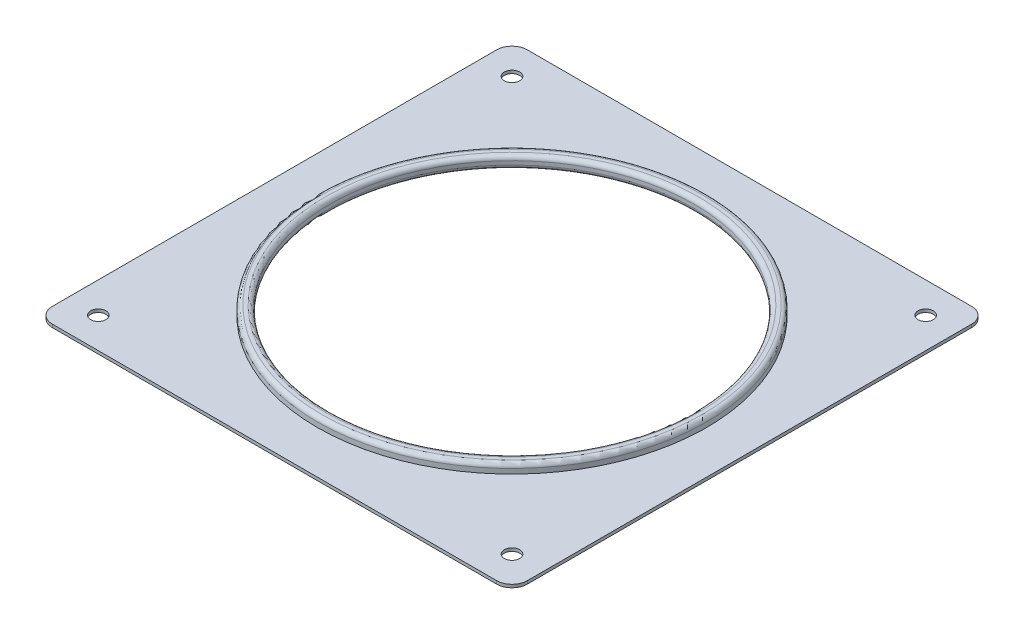
ISO-10303-21;
HEADER;
FILE_DESCRIPTION(('STEP AP214'),'2;1');
FILE_NAME('part.step','',(''),(''),'','','');
FILE_SCHEMA(('AUTOMOTIVE_DESIGN { 1 0 10303 214 1 1 1 1 }'));
ENDSEC;
DATA;
#1=APPLICATION_CONTEXT('core data for automotive mechanical design processes');
#2=APPLICATION_PROTOCOL_DEFINITION('international standard','automotive_design',2000,#1);
#3=PRODUCT_CONTEXT('',#1,'mechanical');
#4=PRODUCT('Part','Part','',(#3));
#5=PRODUCT_RELATED_PRODUCT_CATEGORY('part','',(#4));
#6=PRODUCT_DEFINITION_FORMATION('','',#4);
#7=PRODUCT_DEFINITION_CONTEXT('part definition',#1,'design');
#8=PRODUCT_DEFINITION('design','',#6,#7);
#9=PRODUCT_DEFINITION_SHAPE('','',#8);
#10=(LENGTH_UNIT() NAMED_UNIT(*) SI_UNIT(.MILLI.,.METRE.));
#11=(NAMED_UNIT(*) PLANE_ANGLE_UNIT() SI_UNIT($,.RADIAN.));
#12=(NAMED_UNIT(*) SI_UNIT($,.STERADIAN.) SOLID_ANGLE_UNIT());
#13=UNCERTAINTY_MEASURE_WITH_UNIT(LENGTH_MEASURE(1.E-05),#10,'distance_accuracy_value','');
#14=(GEOMETRIC_REPRESENTATION_CONTEXT(3) GLOBAL_UNCERTAINTY_ASSIGNED_CONTEXT((#13)) GLOBAL_UNIT_ASSIGNED_CONTEXT((#10,
#11,#12)) REPRESENTATION_CONTEXT('',''));
#15=CARTESIAN_POINT('',(0.,0.,0.));
#16=DIRECTION('',(0.,0.,1.));
#17=DIRECTION('',(1.,0.,0.));
#18=AXIS2_PLACEMENT_3D('',#15,#16,#17);
#19=CARTESIAN_POINT('',(-72.5,1.,72.5));
#20=DIRECTION('',(0.,1.,0.));
#21=DIRECTION('',(0.,0.,1.));
#22=AXIS2_PLACEMENT_3D('',#19,#20,#21);
#23=PLANE('',#22);
#24=CARTESIAN_POINT('',(-67.4999999999966,1.,67.5));
#25=DIRECTION('',(0.,1.,0.));
#26=DIRECTION('',(0.,0.,1.));
#27=AXIS2_PLACEMENT_3D('',#24,#25,#26);
#28=CIRCLE('',#27,2.5);
#29=CARTESIAN_POINT('',(-67.4999999999966,1.,70.));
#30=VERTEX_POINT('',#29);
#31=EDGE_CURVE('E387',#30,#30,#28,.T.);
#32=ORIENTED_EDGE('',*,*,#31,.F.);
#33=EDGE_LOOP('',(#32));
#34=FACE_BOUND('',#33,.T.);
#35=CARTESIAN_POINT('',(67.5,1.,-67.5000000000034));
#36=DIRECTION('',(0.,1.,0.));
#37=DIRECTION('',(0.,0.,1.));
#38=AXIS2_PLACEMENT_3D('',#35,#36,#37);
#39=CIRCLE('',#38,2.5);
#40=CARTESIAN_POINT('',(67.5,1.,-65.0000000000034));
#41=VERTEX_POINT('',#40);
#42=EDGE_CURVE('E405',#41,#41,#39,.T.);
#43=ORIENTED_EDGE('',*,*,#42,.F.);
#44=EDGE_LOOP('',(#43));
#45=FACE_BOUND('',#44,.T.);
#46=CARTESIAN_POINT('',(-72.5,1.,72.5));
#47=DIRECTION('',(0.,1.,0.));
#48=DIRECTION('',(0.,0.,1.));
#49=AXIS2_PLACEMENT_3D('',#46,#47,#48);
#50=CIRCLE('',#49,5.);
#51=CARTESIAN_POINT('',(-77.5,1.,72.5));
#52=VERTEX_POINT('',#51);
#53=CARTESIAN_POINT('',(-72.5,1.,77.5));
#54=VERTEX_POINT('',#53);
#55=EDGE_CURVE('E150',#52,#54,#50,.T.);
#56=ORIENTED_EDGE('',*,*,#55,.T.);
#57=DIRECTION('',(1.,0.,0.));
#58=VECTOR('',#57,1.);
#59=CARTESIAN_POINT('',(-72.5,1.,77.5));
#60=LINE('',#59,#58);
#61=CARTESIAN_POINT('',(72.5,1.,77.5));
#62=VERTEX_POINT('',#61);
#63=EDGE_CURVE('E98',#54,#62,#60,.T.);
#64=ORIENTED_EDGE('',*,*,#63,.T.);
#65=CARTESIAN_POINT('',(72.5,1.,72.5));
#66=DIRECTION('',(0.,1.,0.));
#67=DIRECTION('',(0.,0.,1.));
#68=AXIS2_PLACEMENT_3D('',#65,#66,#67);
#69=CIRCLE('',#68,5.);
#70=CARTESIAN_POINT('',(77.5,1.,72.5));
#71=VERTEX_POINT('',#70);
#72=EDGE_CURVE('E416',#62,#71,#69,.T.);
#73=ORIENTED_EDGE('',*,*,#72,.T.);
#74=DIRECTION('',(0.,0.,-1.));
#75=VECTOR('',#74,1.);
#76=CARTESIAN_POINT('',(77.5,1.,72.5));
#77=LINE('',#76,#75);
#78=CARTESIAN_POINT('',(77.5,1.,-72.5));
#79=VERTEX_POINT('',#78);
#80=EDGE_CURVE('E418',#71,#79,#77,.T.);
#81=ORIENTED_EDGE('',*,*,#80,.T.);
#82=CARTESIAN_POINT('',(72.5,1.,-72.5));
#83=DIRECTION('',(0.,1.,0.));
#84=DIRECTION('',(0.,0.,1.));
#85=AXIS2_PLACEMENT_3D('',#82,#83,#84);
#86=CIRCLE('',#85,5.);
#87=CARTESIAN_POINT('',(72.5,1.,-77.5));
#88=VERTEX_POINT('',#87);
#89=EDGE_CURVE('E117',#79,#88,#86,.T.);
#90=ORIENTED_EDGE('',*,*,#89,.T.);
#91=DIRECTION('',(-1.,0.,0.));
#92=VECTOR('',#91,1.);
#93=CARTESIAN_POINT('',(-72.5,1.,-77.5));
#94=LINE('',#93,#92);
#95=CARTESIAN_POINT('',(-72.5,1.,-77.5));
#96=VERTEX_POINT('',#95);
#97=EDGE_CURVE('E111',#88,#96,#94,.T.);
#98=ORIENTED_EDGE('',*,*,#97,.T.);
#99=CARTESIAN_POINT('',(-72.5,1.,-72.5));
#100=DIRECTION('',(0.,1.,0.));
#101=DIRECTION('',(0.,0.,1.));
#102=AXIS2_PLACEMENT_3D('',#99,#100,#101);
#103=CIRCLE('',#102,5.);
#104=CARTESIAN_POINT('',(-77.5,1.,-72.5));
#105=VERTEX_POINT('',#104);
#106=EDGE_CURVE('E115',#96,#105,#103,.T.);
#107=ORIENTED_EDGE('',*,*,#106,.T.);
#108=DIRECTION('',(0.,0.,1.));
#109=VECTOR('',#108,1.);
#110=CARTESIAN_POINT('',(-77.5,1.,72.5));
#111=LINE('',#110,#109);
#112=EDGE_CURVE('E54',#105,#52,#111,.T.);
#113=ORIENTED_EDGE('',*,*,#112,.T.);
#114=EDGE_LOOP('',(#56,#64,#73,#81,#90,#98,#107,#113));
#115=FACE_BOUND('',#114,.T.);
#116=CARTESIAN_POINT('',(-67.5,1.,-67.5));
#117=DIRECTION('',(0.,1.,0.));
#118=DIRECTION('',(0.,0.,1.));
#119=AXIS2_PLACEMENT_3D('',#116,#117,#118);
#120=CIRCLE('',#119,2.5);
#121=CARTESIAN_POINT('',(-67.5,1.,-65.));
#122=VERTEX_POINT('',#121);
#123=EDGE_CURVE('E139',#122,#122,#120,.T.);
#124=ORIENTED_EDGE('',*,*,#123,.F.);
#125=EDGE_LOOP('',(#124));
#126=FACE_BOUND('',#125,.T.);
#127=CARTESIAN_POINT('',(67.5000000000034,1.,67.4999999999966));
#128=DIRECTION('',(0.,1.,0.));
#129=DIRECTION('',(0.,0.,1.));
#130=AXIS2_PLACEMENT_3D('',#127,#128,#129);
#131=CIRCLE('',#130,2.5);
#132=CARTESIAN_POINT('',(67.5000000000034,1.,69.9999999999966));
#133=VERTEX_POINT('',#132);
#134=EDGE_CURVE('E399',#133,#133,#131,.T.);
#135=ORIENTED_EDGE('',*,*,#134,.F.);
#136=EDGE_LOOP('',(#135));
#137=FACE_BOUND('',#136,.T.);
#138=CARTESIAN_POINT('',(0.,1.,0.));
#139=DIRECTION('',(0.,1.,0.));
#140=DIRECTION('',(0.,0.,1.));
#141=AXIS2_PLACEMENT_3D('',#138,#139,#140);
#142=CIRCLE('',#141,63.5);
#143=CARTESIAN_POINT('',(0.,1.,63.5));
#144=VERTEX_POINT('',#143);
#145=EDGE_CURVE('E392',#144,#144,#142,.T.);
#146=ORIENTED_EDGE('',*,*,#145,.F.);
#147=EDGE_LOOP('',(#146));
#148=FACE_BOUND('',#147,.T.);
#149=ADVANCED_FACE('F37',(#34,#45,#115,#126,#137,#148),#23,.T.);
#150=CARTESIAN_POINT('',(-72.5,0.,72.5));
#151=DIRECTION('',(0.,1.,0.));
#152=DIRECTION('',(0.,0.,1.));
#153=AXIS2_PLACEMENT_3D('',#150,#151,#152);
#154=PLANE('',#153);
#155=CARTESIAN_POINT('',(0.,0.,0.));
#156=DIRECTION('',(0.,1.,0.));
#157=DIRECTION('',(0.,0.,1.));
#158=AXIS2_PLACEMENT_3D('',#155,#156,#157);
#159=CIRCLE('',#158,60.9);
#160=CARTESIAN_POINT('',(0.,0.,60.9));
#161=VERTEX_POINT('',#160);
#162=EDGE_CURVE('E46',#161,#161,#159,.T.);
#163=ORIENTED_EDGE('',*,*,#162,.T.);
#164=EDGE_LOOP('',(#163));
#165=FACE_BOUND('',#164,.T.);
#166=CARTESIAN_POINT('',(-72.5,0.,72.5));
#167=DIRECTION('',(0.,1.,0.));
#168=DIRECTION('',(0.,0.,1.));
#169=AXIS2_PLACEMENT_3D('',#166,#167,#168);
#170=CIRCLE('',#169,5.);
#171=CARTESIAN_POINT('',(-77.5,0.,72.5));
#172=VERTEX_POINT('',#171);
#173=CARTESIAN_POINT('',(-72.5,0.,77.5));
#174=VERTEX_POINT('',#173);
#175=EDGE_CURVE('E135',#172,#174,#170,.T.);
#176=ORIENTED_EDGE('',*,*,#175,.F.);
#177=DIRECTION('',(0.,0.,1.));
#178=VECTOR('',#177,1.);
#179=CARTESIAN_POINT('',(-77.5,0.,72.5));
#180=LINE('',#179,#178);
#181=CARTESIAN_POINT('',(-77.5,0.,-72.5));
#182=VERTEX_POINT('',#181);
#183=EDGE_CURVE('E89',#182,#172,#180,.T.);
#184=ORIENTED_EDGE('',*,*,#183,.F.);
#185=CARTESIAN_POINT('',(-72.5,0.,-72.5));
#186=DIRECTION('',(0.,1.,0.));
#187=DIRECTION('',(0.,0.,1.));
#188=AXIS2_PLACEMENT_3D('',#185,#186,#187);
#189=CIRCLE('',#188,5.);
#190=CARTESIAN_POINT('',(-72.5,0.,-77.5));
#191=VERTEX_POINT('',#190);
#192=EDGE_CURVE('E83',#191,#182,#189,.T.);
#193=ORIENTED_EDGE('',*,*,#192,.F.);
#194=DIRECTION('',(-1.,0.,0.));
#195=VECTOR('',#194,1.);
#196=CARTESIAN_POINT('',(-72.5,0.,-77.5));
#197=LINE('',#196,#195);
#198=CARTESIAN_POINT('',(72.5,0.,-77.5));
#199=VERTEX_POINT('',#198);
#200=EDGE_CURVE('E125',#199,#191,#197,.T.);
#201=ORIENTED_EDGE('',*,*,#200,.F.);
#202=CARTESIAN_POINT('',(72.5,0.,-72.5));
#203=DIRECTION('',(0.,1.,0.));
#204=DIRECTION('',(0.,0.,1.));
#205=AXIS2_PLACEMENT_3D('',#202,#203,#204);
#206=CIRCLE('',#205,5.);
#207=CARTESIAN_POINT('',(77.5,0.,-72.5));
#208=VERTEX_POINT('',#207);
#209=EDGE_CURVE('E145',#208,#199,#206,.T.);
#210=ORIENTED_EDGE('',*,*,#209,.F.);
#211=DIRECTION('',(0.,0.,-1.));
#212=VECTOR('',#211,1.);
#213=CARTESIAN_POINT('',(77.5,0.,72.5));
#214=LINE('',#213,#212);
#215=CARTESIAN_POINT('',(77.5,0.,72.5));
#216=VERTEX_POINT('',#215);
#217=EDGE_CURVE('E143',#216,#208,#214,.T.);
#218=ORIENTED_EDGE('',*,*,#217,.F.);
#219=CARTESIAN_POINT('',(72.5,0.,72.5));
#220=DIRECTION('',(0.,1.,0.));
#221=DIRECTION('',(0.,0.,1.));
#222=AXIS2_PLACEMENT_3D('',#219,#220,#221);
#223=CIRCLE('',#222,5.);
#224=CARTESIAN_POINT('',(72.5,0.,77.5));
#225=VERTEX_POINT('',#224);
#226=EDGE_CURVE('E141',#225,#216,#223,.T.);
#227=ORIENTED_EDGE('',*,*,#226,.F.);
#228=DIRECTION('',(1.,0.,0.));
#229=VECTOR('',#228,1.);
#230=CARTESIAN_POINT('',(-72.5,0.,77.5));
#231=LINE('',#230,#229);
#232=EDGE_CURVE('E138',#174,#225,#231,.T.);
#233=ORIENTED_EDGE('',*,*,#232,.F.);
#234=EDGE_LOOP('',(#176,#184,#193,#201,#210,#218,#227,#233));
#235=FACE_BOUND('',#234,.T.);
#236=CARTESIAN_POINT('',(-67.5,0.,-67.5));
#237=DIRECTION('',(0.,1.,0.));
#238=DIRECTION('',(0.,0.,1.));
#239=AXIS2_PLACEMENT_3D('',#236,#237,#238);
#240=CIRCLE('',#239,2.5);
#241=CARTESIAN_POINT('',(-67.5,0.,-65.));
#242=VERTEX_POINT('',#241);
#243=EDGE_CURVE('E408',#242,#242,#240,.T.);
#244=ORIENTED_EDGE('',*,*,#243,.T.);
#245=EDGE_LOOP('',(#244));
#246=FACE_BOUND('',#245,.T.);
#247=CARTESIAN_POINT('',(67.5,0.,-67.5000000000034));
#248=DIRECTION('',(0.,1.,0.));
#249=DIRECTION('',(0.,0.,1.));
#250=AXIS2_PLACEMENT_3D('',#247,#248,#249);
#251=CIRCLE('',#250,2.5);
#252=CARTESIAN_POINT('',(67.5,0.,-65.0000000000034));
#253=VERTEX_POINT('',#252);
#254=EDGE_CURVE('E402',#253,#253,#251,.T.);
#255=ORIENTED_EDGE('',*,*,#254,.T.);
#256=EDGE_LOOP('',(#255));
#257=FACE_BOUND('',#256,.T.);
#258=CARTESIAN_POINT('',(67.5000000000034,0.,67.4999999999966));
#259=DIRECTION('',(0.,1.,0.));
#260=DIRECTION('',(0.,0.,1.));
#261=AXIS2_PLACEMENT_3D('',#258,#259,#260);
#262=CIRCLE('',#261,2.5);
#263=CARTESIAN_POINT('',(67.5000000000034,0.,69.9999999999966));
#264=VERTEX_POINT('',#263);
#265=EDGE_CURVE('E394',#264,#264,#262,.T.);
#266=ORIENTED_EDGE('',*,*,#265,.T.);
#267=EDGE_LOOP('',(#266));
#268=FACE_BOUND('',#267,.T.);
#269=CARTESIAN_POINT('',(-67.4999999999966,0.,67.5));
#270=DIRECTION('',(0.,1.,0.));
#271=DIRECTION('',(0.,0.,1.));
#272=AXIS2_PLACEMENT_3D('',#269,#270,#271);
#273=CIRCLE('',#272,2.5);
#274=CARTESIAN_POINT('',(-67.4999999999966,0.,70.));
#275=VERTEX_POINT('',#274);
#276=EDGE_CURVE('E390',#275,#275,#273,.T.);
#277=ORIENTED_EDGE('',*,*,#276,.T.);
#278=EDGE_LOOP('',(#277));
#279=FACE_BOUND('',#278,.T.);
#280=ADVANCED_FACE('F179',(#165,#235,#246,#257,#268,#279),#154,.F.);
#281=CARTESIAN_POINT('',(-72.5,1.,72.5));
#282=DIRECTION('',(0.,-1.,0.));
#283=DIRECTION('',(0.,0.,-1.));
#284=AXIS2_PLACEMENT_3D('',#281,#282,#283);
#285=CYLINDRICAL_SURFACE('',#284,5.);
#286=ORIENTED_EDGE('',*,*,#175,.T.);
#287=DIRECTION('',(0.,-1.,0.));
#288=VECTOR('',#287,1.);
#289=CARTESIAN_POINT('',(-72.5,1.,77.5));
#290=LINE('',#289,#288);
#291=EDGE_CURVE('E163',#54,#174,#290,.T.);
#292=ORIENTED_EDGE('',*,*,#291,.F.);
#293=ORIENTED_EDGE('',*,*,#55,.F.);
#294=DIRECTION('',(0.,-1.,0.));
#295=VECTOR('',#294,1.);
#296=CARTESIAN_POINT('',(-77.5,1.,72.5));
#297=LINE('',#296,#295);
#298=EDGE_CURVE('E131',#52,#172,#297,.T.);
#299=ORIENTED_EDGE('',*,*,#298,.T.);
#300=EDGE_LOOP('',(#286,#292,#293,#299));
#301=FACE_BOUND('',#300,.T.);
#302=ADVANCED_FACE('F197',(#301),#285,.T.);
#303=CARTESIAN_POINT('',(-72.5,1.,77.5));
#304=DIRECTION('',(0.,0.,-1.));
#305=DIRECTION('',(-1.,0.,0.));
#306=AXIS2_PLACEMENT_3D('',#303,#304,#305);
#307=PLANE('',#306);
#308=ORIENTED_EDGE('',*,*,#232,.T.);
#309=DIRECTION('',(0.,-1.,0.));
#310=VECTOR('',#309,1.);
#311=CARTESIAN_POINT('',(72.5,1.,77.5));
#312=LINE('',#311,#310);
#313=EDGE_CURVE('E160',#62,#225,#312,.T.);
#314=ORIENTED_EDGE('',*,*,#313,.F.);
#315=ORIENTED_EDGE('',*,*,#63,.F.);
#316=ORIENTED_EDGE('',*,*,#291,.T.);
#317=EDGE_LOOP('',(#308,#314,#315,#316));
#318=FACE_BOUND('',#317,.T.);
#319=ADVANCED_FACE('F223',(#318),#307,.F.);
#320=CARTESIAN_POINT('',(72.5,1.,72.5));
#321=DIRECTION('',(0.,-1.,0.));
#322=DIRECTION('',(0.,0.,-1.));
#323=AXIS2_PLACEMENT_3D('',#320,#321,#322);
#324=CYLINDRICAL_SURFACE('',#323,5.);
#325=ORIENTED_EDGE('',*,*,#226,.T.);
#326=DIRECTION('',(0.,-1.,0.));
#327=VECTOR('',#326,1.);
#328=CARTESIAN_POINT('',(77.5,1.,72.5));
#329=LINE('',#328,#327);
#330=EDGE_CURVE('E157',#71,#216,#329,.T.);
#331=ORIENTED_EDGE('',*,*,#330,.F.);
#332=ORIENTED_EDGE('',*,*,#72,.F.);
#333=ORIENTED_EDGE('',*,*,#313,.T.);
#334=EDGE_LOOP('',(#325,#331,#332,#333));
#335=FACE_BOUND('',#334,.T.);
#336=ADVANCED_FACE('F219',(#335),#324,.T.);
#337=CARTESIAN_POINT('',(77.5,1.,72.5));
#338=DIRECTION('',(-1.,0.,0.));
#339=DIRECTION('',(0.,0.,1.));
#340=AXIS2_PLACEMENT_3D('',#337,#338,#339);
#341=PLANE('',#340);
#342=ORIENTED_EDGE('',*,*,#217,.T.);
#343=DIRECTION('',(0.,-1.,0.));
#344=VECTOR('',#343,1.);
#345=CARTESIAN_POINT('',(77.5,1.,-72.5));
#346=LINE('',#345,#344);
#347=EDGE_CURVE('E154',#79,#208,#346,.T.);
#348=ORIENTED_EDGE('',*,*,#347,.F.);
#349=ORIENTED_EDGE('',*,*,#80,.F.);
#350=ORIENTED_EDGE('',*,*,#330,.T.);
#351=EDGE_LOOP('',(#342,#348,#349,#350));
#352=FACE_BOUND('',#351,.T.);
#353=ADVANCED_FACE('F215',(#352),#341,.F.);
#354=CARTESIAN_POINT('',(72.5,1.,-72.5));
#355=DIRECTION('',(0.,-1.,0.));
#356=DIRECTION('',(0.,0.,-1.));
#357=AXIS2_PLACEMENT_3D('',#354,#355,#356);
#358=CYLINDRICAL_SURFACE('',#357,5.);
#359=ORIENTED_EDGE('',*,*,#209,.T.);
#360=DIRECTION('',(0.,-1.,0.));
#361=VECTOR('',#360,1.);
#362=CARTESIAN_POINT('',(72.5,1.,-77.5));
#363=LINE('',#362,#361);
#364=EDGE_CURVE('E126',#88,#199,#363,.T.);
#365=ORIENTED_EDGE('',*,*,#364,.F.);
#366=ORIENTED_EDGE('',*,*,#89,.F.);
#367=ORIENTED_EDGE('',*,*,#347,.T.);
#368=EDGE_LOOP('',(#359,#365,#366,#367));
#369=FACE_BOUND('',#368,.T.);
#370=ADVANCED_FACE('F212',(#369),#358,.T.);
#371=CARTESIAN_POINT('',(-72.5,1.,-77.5));
#372=DIRECTION('',(0.,0.,1.));
#373=DIRECTION('',(1.,0.,0.));
#374=AXIS2_PLACEMENT_3D('',#371,#372,#373);
#375=PLANE('',#374);
#376=ORIENTED_EDGE('',*,*,#200,.T.);
#377=DIRECTION('',(0.,-1.,0.));
#378=VECTOR('',#377,1.);
#379=CARTESIAN_POINT('',(-72.5,1.,-77.5));
#380=LINE('',#379,#378);
#381=EDGE_CURVE('E122',#96,#191,#380,.T.);
#382=ORIENTED_EDGE('',*,*,#381,.F.);
#383=ORIENTED_EDGE('',*,*,#97,.F.);
#384=ORIENTED_EDGE('',*,*,#364,.T.);
#385=EDGE_LOOP('',(#376,#382,#383,#384));
#386=FACE_BOUND('',#385,.T.);
#387=ADVANCED_FACE('F123',(#386),#375,.F.);
#388=CARTESIAN_POINT('',(-72.5,1.,-72.5));
#389=DIRECTION('',(0.,-1.,0.));
#390=DIRECTION('',(0.,0.,-1.));
#391=AXIS2_PLACEMENT_3D('',#388,#389,#390);
#392=CYLINDRICAL_SURFACE('',#391,5.);
#393=ORIENTED_EDGE('',*,*,#192,.T.);
#394=DIRECTION('',(0.,-1.,0.));
#395=VECTOR('',#394,1.);
#396=CARTESIAN_POINT('',(-77.5,1.,-72.5));
#397=LINE('',#396,#395);
#398=EDGE_CURVE('E127',#105,#182,#397,.T.);
#399=ORIENTED_EDGE('',*,*,#398,.F.);
#400=ORIENTED_EDGE('',*,*,#106,.F.);
#401=ORIENTED_EDGE('',*,*,#381,.T.);
#402=EDGE_LOOP('',(#393,#399,#400,#401));
#403=FACE_BOUND('',#402,.T.);
#404=ADVANCED_FACE('F129',(#403),#392,.T.);
#405=CARTESIAN_POINT('',(-77.5,1.,72.5));
#406=DIRECTION('',(1.,0.,0.));
#407=DIRECTION('',(0.,0.,-1.));
#408=AXIS2_PLACEMENT_3D('',#405,#406,#407);
#409=PLANE('',#408);
#410=ORIENTED_EDGE('',*,*,#183,.T.);
#411=ORIENTED_EDGE('',*,*,#298,.F.);
#412=ORIENTED_EDGE('',*,*,#112,.F.);
#413=ORIENTED_EDGE('',*,*,#398,.T.);
#414=EDGE_LOOP('',(#410,#411,#412,#413));
#415=FACE_BOUND('',#414,.T.);
#416=ADVANCED_FACE('F205',(#415),#409,.F.);
#417=CARTESIAN_POINT('',(0.,1.,0.));
#418=DIRECTION('',(0.,-1.,0.));
#419=DIRECTION('',(0.,0.,-1.));
#420=AXIS2_PLACEMENT_3D('',#417,#418,#419);
#421=CYLINDRICAL_SURFACE('',#420,59.5);
#422=CARTESIAN_POINT('',(0.,1.4,0.));
#423=DIRECTION('',(0.,1.,0.));
#424=DIRECTION('',(0.,0.,1.));
#425=AXIS2_PLACEMENT_3D('',#422,#423,#424);
#426=CIRCLE('',#425,59.5);
#427=CARTESIAN_POINT('',(0.,1.4,59.5));
#428=VERTEX_POINT('',#427);
#429=EDGE_CURVE('E11',#428,#428,#426,.F.);
#430=ORIENTED_EDGE('',*,*,#429,.T.);
#431=EDGE_LOOP('',(#430));
#432=FACE_BOUND('',#431,.T.);
#433=CARTESIAN_POINT('',(0.,2.6,0.));
#434=DIRECTION('',(0.,1.,0.));
#435=DIRECTION('',(0.,0.,1.));
#436=AXIS2_PLACEMENT_3D('',#433,#434,#435);
#437=CIRCLE('',#436,59.5);
#438=CARTESIAN_POINT('',(0.,2.6,59.5));
#439=VERTEX_POINT('',#438);
#440=EDGE_CURVE('E165',#439,#439,#437,.T.);
#441=ORIENTED_EDGE('',*,*,#440,.T.);
#442=EDGE_LOOP('',(#441));
#443=FACE_BOUND('',#442,.T.);
#444=ADVANCED_FACE('F202',(#432,#443),#421,.F.);
#445=CARTESIAN_POINT('',(-67.5,1.,-67.5));
#446=DIRECTION('',(0.,-1.,0.));
#447=DIRECTION('',(0.,0.,-1.));
#448=AXIS2_PLACEMENT_3D('',#445,#446,#447);
#449=CYLINDRICAL_SURFACE('',#448,2.5);
#450=ORIENTED_EDGE('',*,*,#123,.T.);
#451=EDGE_LOOP('',(#450));
#452=FACE_BOUND('',#451,.T.);
#453=ORIENTED_EDGE('',*,*,#243,.F.);
#454=EDGE_LOOP('',(#453));
#455=FACE_BOUND('',#454,.T.);
#456=ADVANCED_FACE('F244',(#452,#455),#449,.F.);
#457=CARTESIAN_POINT('',(67.5,1.,-67.5000000000034));
#458=DIRECTION('',(0.,-1.,0.));
#459=DIRECTION('',(0.,0.,-1.));
#460=AXIS2_PLACEMENT_3D('',#457,#458,#459);
#461=CYLINDRICAL_SURFACE('',#460,2.5);
#462=ORIENTED_EDGE('',*,*,#42,.T.);
#463=EDGE_LOOP('',(#462));
#464=FACE_BOUND('',#463,.T.);
#465=ORIENTED_EDGE('',*,*,#254,.F.);
#466=EDGE_LOOP('',(#465));
#467=FACE_BOUND('',#466,.T.);
#468=ADVANCED_FACE('F249',(#464,#467),#461,.F.);
#469=CARTESIAN_POINT('',(67.5000000000034,1.,67.4999999999966));
#470=DIRECTION('',(0.,-1.,0.));
#471=DIRECTION('',(0.,0.,-1.));
#472=AXIS2_PLACEMENT_3D('',#469,#470,#471);
#473=CYLINDRICAL_SURFACE('',#472,2.5);
#474=ORIENTED_EDGE('',*,*,#134,.T.);
#475=EDGE_LOOP('',(#474));
#476=FACE_BOUND('',#475,.T.);
#477=ORIENTED_EDGE('',*,*,#265,.F.);
#478=EDGE_LOOP('',(#477));
#479=FACE_BOUND('',#478,.T.);
#480=ADVANCED_FACE('F254',(#476,#479),#473,.F.);
#481=CARTESIAN_POINT('',(-67.4999999999966,1.,67.5));
#482=DIRECTION('',(0.,-1.,0.));
#483=DIRECTION('',(0.,0.,-1.));
#484=AXIS2_PLACEMENT_3D('',#481,#482,#483);
#485=CYLINDRICAL_SURFACE('',#484,2.5);
#486=ORIENTED_EDGE('',*,*,#31,.T.);
#487=EDGE_LOOP('',(#486));
#488=FACE_BOUND('',#487,.T.);
#489=ORIENTED_EDGE('',*,*,#276,.F.);
#490=EDGE_LOOP('',(#489));
#491=FACE_BOUND('',#490,.T.);
#492=ADVANCED_FACE('F262',(#488,#491),#485,.F.);
#493=CARTESIAN_POINT('',(0.,4.,0.));
#494=DIRECTION('',(0.,1.,0.));
#495=DIRECTION('',(0.,0.,1.));
#496=AXIS2_PLACEMENT_3D('',#493,#494,#495);
#497=PLANE('',#496);
#498=CARTESIAN_POINT('',(0.,4.,0.));
#499=DIRECTION('',(0.,1.,0.));
#500=DIRECTION('',(0.,0.,1.));
#501=AXIS2_PLACEMENT_3D('',#498,#499,#500);
#502=CIRCLE('',#501,60.9);
#503=CARTESIAN_POINT('',(0.,4.,60.9));
#504=VERTEX_POINT('',#503);
#505=EDGE_CURVE('E171',#504,#504,#502,.F.);
#506=ORIENTED_EDGE('',*,*,#505,.T.);
#507=EDGE_LOOP('',(#506));
#508=FACE_BOUND('',#507,.T.);
#509=CARTESIAN_POINT('',(0.,4.,0.));
#510=DIRECTION('',(0.,1.,0.));
#511=DIRECTION('',(0.,0.,1.));
#512=AXIS2_PLACEMENT_3D('',#509,#510,#511);
#513=CIRCLE('',#512,62.1);
#514=CARTESIAN_POINT('',(0.,4.,62.1));
#515=VERTEX_POINT('',#514);
#516=EDGE_CURVE('E168',#515,#515,#513,.T.);
#517=ORIENTED_EDGE('',*,*,#516,.T.);
#518=EDGE_LOOP('',(#517));
#519=FACE_BOUND('',#518,.T.);
#520=ADVANCED_FACE('F236',(#508,#519),#497,.T.);
#521=CARTESIAN_POINT('',(0.,4.,0.));
#522=DIRECTION('',(0.,-1.,0.));
#523=DIRECTION('',(0.,0.,-1.));
#524=AXIS2_PLACEMENT_3D('',#521,#522,#523);
#525=CYLINDRICAL_SURFACE('',#524,63.5);
#526=CARTESIAN_POINT('',(0.,2.6,0.));
#527=DIRECTION('',(0.,1.,0.));
#528=DIRECTION('',(0.,0.,1.));
#529=AXIS2_PLACEMENT_3D('',#526,#527,#528);
#530=CIRCLE('',#529,63.5);
#531=CARTESIAN_POINT('',(0.,2.6,63.5));
#532=VERTEX_POINT('',#531);
#533=EDGE_CURVE('E174',#532,#532,#530,.F.);
#534=ORIENTED_EDGE('',*,*,#533,.T.);
#535=EDGE_LOOP('',(#534));
#536=FACE_BOUND('',#535,.T.);
#537=ORIENTED_EDGE('',*,*,#145,.T.);
#538=EDGE_LOOP('',(#537));
#539=FACE_BOUND('',#538,.T.);
#540=ADVANCED_FACE('F231',(#536,#539),#525,.T.);
#541=CARTESIAN_POINT('',(0.,2.6,0.));
#542=DIRECTION('',(0.,1.,0.));
#543=DIRECTION('',(0.,0.,1.));
#544=AXIS2_PLACEMENT_3D('',#541,#542,#543);
#545=TOROIDAL_SURFACE('',#544,60.9,1.4);
#546=ORIENTED_EDGE('',*,*,#505,.F.);
#547=EDGE_LOOP('',(#546));
#548=FACE_BOUND('',#547,.T.);
#549=ORIENTED_EDGE('',*,*,#440,.F.);
#550=EDGE_LOOP('',(#549));
#551=FACE_BOUND('',#550,.T.);
#552=ADVANCED_FACE('F188',(#548,#551),#545,.T.);
#553=CARTESIAN_POINT('',(0.,2.6,0.));
#554=DIRECTION('',(0.,1.,0.));
#555=DIRECTION('',(0.,0.,1.));
#556=AXIS2_PLACEMENT_3D('',#553,#554,#555);
#557=TOROIDAL_SURFACE('',#556,62.1,1.4);
#558=ORIENTED_EDGE('',*,*,#533,.F.);
#559=EDGE_LOOP('',(#558));
#560=FACE_BOUND('',#559,.T.);
#561=ORIENTED_EDGE('',*,*,#516,.F.);
#562=EDGE_LOOP('',(#561));
#563=FACE_BOUND('',#562,.T.);
#564=ADVANCED_FACE('F183',(#560,#563),#557,.T.);
#565=CARTESIAN_POINT('',(0.,1.4,0.));
#566=DIRECTION('',(0.,1.,0.));
#567=DIRECTION('',(0.,0.,1.));
#568=AXIS2_PLACEMENT_3D('',#565,#566,#567);
#569=TOROIDAL_SURFACE('',#568,60.9,1.4);
#570=ORIENTED_EDGE('',*,*,#429,.F.);
#571=EDGE_LOOP('',(#570));
#572=FACE_BOUND('',#571,.T.);
#573=ORIENTED_EDGE('',*,*,#162,.F.);
#574=EDGE_LOOP('',(#573));
#575=FACE_BOUND('',#574,.T.);
#576=ADVANCED_FACE('F39',(#572,#575),#569,.T.);
#577=CLOSED_SHELL('',(#149,#280,#302,#319,#336,#353,#370,#387,#404,#416,#444,#456,#468,#480,
#492,#520,#540,#552,#564,#576));
#578=MANIFOLD_SOLID_BREP('B2',#577);
#579=ADVANCED_BREP_SHAPE_REPRESENTATION('',(#18,#578),#14);
#580=SHAPE_DEFINITION_REPRESENTATION(#9,#579);
ENDSEC;
END-ISO-10303-21;
